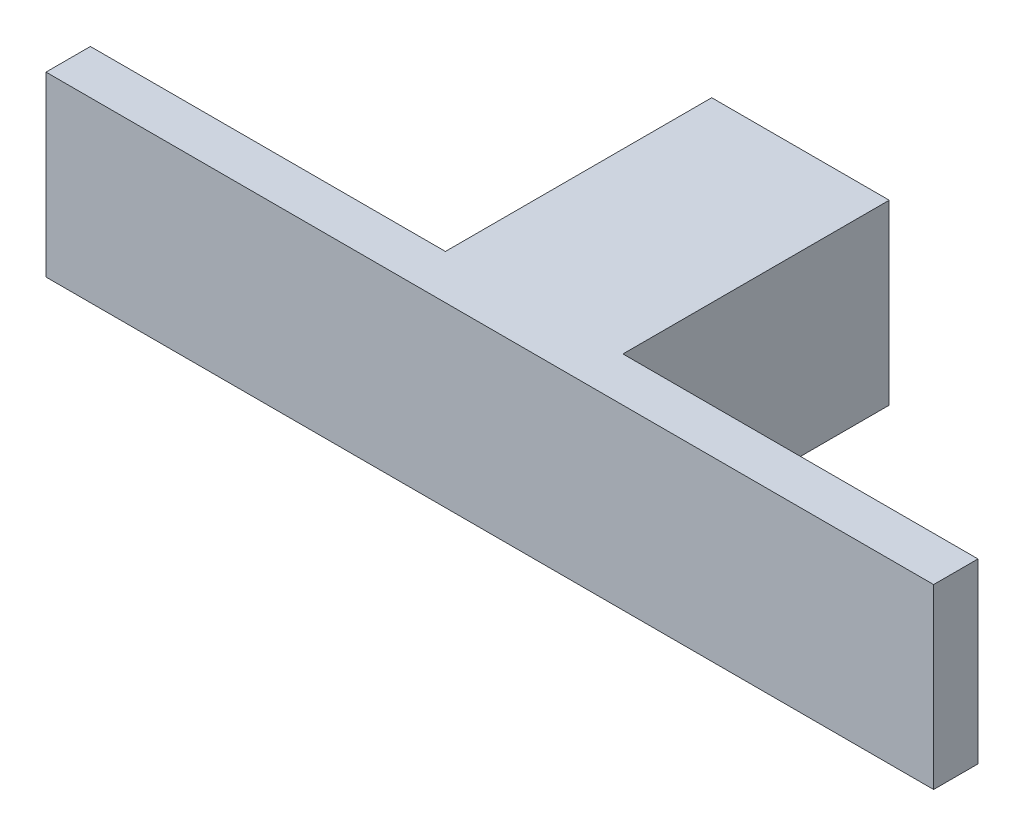
ISO-10303-21;
HEADER;
FILE_DESCRIPTION(('STEP AP214'),'2;1');
FILE_NAME('part.step','',(''),(''),'','','');
FILE_SCHEMA(('AUTOMOTIVE_DESIGN { 1 0 10303 214 1 1 1 1 }'));
ENDSEC;
DATA;
#1=APPLICATION_CONTEXT('core data for automotive mechanical design processes');
#2=APPLICATION_PROTOCOL_DEFINITION('international standard','automotive_design',2000,#1);
#3=PRODUCT_CONTEXT('',#1,'mechanical');
#4=PRODUCT('Part','Part','',(#3));
#5=PRODUCT_RELATED_PRODUCT_CATEGORY('part','',(#4));
#6=PRODUCT_DEFINITION_FORMATION('','',#4);
#7=PRODUCT_DEFINITION_CONTEXT('part definition',#1,'design');
#8=PRODUCT_DEFINITION('design','',#6,#7);
#9=PRODUCT_DEFINITION_SHAPE('','',#8);
#10=(LENGTH_UNIT() NAMED_UNIT(*) SI_UNIT(.MILLI.,.METRE.));
#11=(NAMED_UNIT(*) PLANE_ANGLE_UNIT() SI_UNIT($,.RADIAN.));
#12=(NAMED_UNIT(*) SI_UNIT($,.STERADIAN.) SOLID_ANGLE_UNIT());
#13=UNCERTAINTY_MEASURE_WITH_UNIT(LENGTH_MEASURE(1.E-05),#10,'distance_accuracy_value','');
#14=(GEOMETRIC_REPRESENTATION_CONTEXT(3) GLOBAL_UNCERTAINTY_ASSIGNED_CONTEXT((#13)) GLOBAL_UNIT_ASSIGNED_CONTEXT((#10,
#11,#12)) REPRESENTATION_CONTEXT('',''));
#15=CARTESIAN_POINT('',(0.,0.,0.));
#16=DIRECTION('',(0.,0.,1.));
#17=DIRECTION('',(1.,0.,0.));
#18=AXIS2_PLACEMENT_3D('',#15,#16,#17);
#19=CARTESIAN_POINT('',(50.,20.,35.));
#20=DIRECTION('',(-1.,0.,0.));
#21=DIRECTION('',(0.,0.,1.));
#22=AXIS2_PLACEMENT_3D('',#19,#20,#21);
#23=PLANE('',#22);
#24=DIRECTION('',(0.,0.,-1.));
#25=VECTOR('',#24,1.);
#26=CARTESIAN_POINT('',(50.,0.,35.));
#27=LINE('',#26,#25);
#28=CARTESIAN_POINT('',(50.,0.,35.));
#29=VERTEX_POINT('',#28);
#30=CARTESIAN_POINT('',(50.,0.,30.));
#31=VERTEX_POINT('',#30);
#32=EDGE_CURVE('E140',#29,#31,#27,.T.);
#33=ORIENTED_EDGE('',*,*,#32,.T.);
#34=DIRECTION('',(0.,-1.,0.));
#35=VECTOR('',#34,1.);
#36=CARTESIAN_POINT('',(50.,20.,30.));
#37=LINE('',#36,#35);
#38=CARTESIAN_POINT('',(50.,20.,30.));
#39=VERTEX_POINT('',#38);
#40=EDGE_CURVE('E11',#39,#31,#37,.T.);
#41=ORIENTED_EDGE('',*,*,#40,.F.);
#42=DIRECTION('',(0.,0.,-1.));
#43=VECTOR('',#42,1.);
#44=CARTESIAN_POINT('',(50.,20.,35.));
#45=LINE('',#44,#43);
#46=CARTESIAN_POINT('',(50.,20.,35.));
#47=VERTEX_POINT('',#46);
#48=EDGE_CURVE('E162',#47,#39,#45,.T.);
#49=ORIENTED_EDGE('',*,*,#48,.F.);
#50=DIRECTION('',(0.,-1.,0.));
#51=VECTOR('',#50,1.);
#52=CARTESIAN_POINT('',(50.,20.,35.));
#53=LINE('',#52,#51);
#54=EDGE_CURVE('E136',#47,#29,#53,.T.);
#55=ORIENTED_EDGE('',*,*,#54,.T.);
#56=EDGE_LOOP('',(#33,#41,#49,#55));
#57=FACE_BOUND('',#56,.T.);
#58=ADVANCED_FACE('F39',(#57),#23,.F.);
#59=CARTESIAN_POINT('',(50.,20.,30.));
#60=DIRECTION('',(0.,0.,1.));
#61=DIRECTION('',(1.,0.,0.));
#62=AXIS2_PLACEMENT_3D('',#59,#60,#61);
#63=PLANE('',#62);
#64=DIRECTION('',(-1.,0.,0.));
#65=VECTOR('',#64,1.);
#66=CARTESIAN_POINT('',(50.,0.,30.));
#67=LINE('',#66,#65);
#68=CARTESIAN_POINT('',(10.,0.,30.));
#69=VERTEX_POINT('',#68);
#70=EDGE_CURVE('E144',#31,#69,#67,.T.);
#71=ORIENTED_EDGE('',*,*,#70,.T.);
#72=DIRECTION('',(0.,-1.,0.));
#73=VECTOR('',#72,1.);
#74=CARTESIAN_POINT('',(10.,20.,30.));
#75=LINE('',#74,#73);
#76=CARTESIAN_POINT('',(10.,20.,30.));
#77=VERTEX_POINT('',#76);
#78=EDGE_CURVE('E48',#77,#69,#75,.T.);
#79=ORIENTED_EDGE('',*,*,#78,.F.);
#80=DIRECTION('',(-1.,0.,0.));
#81=VECTOR('',#80,1.);
#82=CARTESIAN_POINT('',(50.,20.,30.));
#83=LINE('',#82,#81);
#84=EDGE_CURVE('E99',#39,#77,#83,.T.);
#85=ORIENTED_EDGE('',*,*,#84,.F.);
#86=ORIENTED_EDGE('',*,*,#40,.T.);
#87=EDGE_LOOP('',(#71,#79,#85,#86));
#88=FACE_BOUND('',#87,.T.);
#89=ADVANCED_FACE('F208',(#88),#63,.F.);
#90=CARTESIAN_POINT('',(10.,20.,30.));
#91=DIRECTION('',(-1.,0.,0.));
#92=DIRECTION('',(0.,0.,1.));
#93=AXIS2_PLACEMENT_3D('',#90,#91,#92);
#94=PLANE('',#93);
#95=DIRECTION('',(0.,0.,-1.));
#96=VECTOR('',#95,1.);
#97=CARTESIAN_POINT('',(10.,0.,30.));
#98=LINE('',#97,#96);
#99=CARTESIAN_POINT('',(10.,0.,0.));
#100=VERTEX_POINT('',#99);
#101=EDGE_CURVE('E147',#69,#100,#98,.T.);
#102=ORIENTED_EDGE('',*,*,#101,.T.);
#103=DIRECTION('',(0.,-1.,0.));
#104=VECTOR('',#103,1.);
#105=CARTESIAN_POINT('',(10.,20.,0.));
#106=LINE('',#105,#104);
#107=CARTESIAN_POINT('',(10.,20.,0.));
#108=VERTEX_POINT('',#107);
#109=EDGE_CURVE('E173',#108,#100,#106,.T.);
#110=ORIENTED_EDGE('',*,*,#109,.F.);
#111=DIRECTION('',(0.,0.,-1.));
#112=VECTOR('',#111,1.);
#113=CARTESIAN_POINT('',(10.,20.,30.));
#114=LINE('',#113,#112);
#115=EDGE_CURVE('E183',#77,#108,#114,.T.);
#116=ORIENTED_EDGE('',*,*,#115,.F.);
#117=ORIENTED_EDGE('',*,*,#78,.T.);
#118=EDGE_LOOP('',(#102,#110,#116,#117));
#119=FACE_BOUND('',#118,.T.);
#120=ADVANCED_FACE('F181',(#119),#94,.F.);
#121=CARTESIAN_POINT('',(-10.,20.,0.));
#122=DIRECTION('',(0.,0.,1.));
#123=DIRECTION('',(1.,0.,0.));
#124=AXIS2_PLACEMENT_3D('',#121,#122,#123);
#125=PLANE('',#124);
#126=DIRECTION('',(-1.,0.,0.));
#127=VECTOR('',#126,1.);
#128=CARTESIAN_POINT('',(-10.,0.,0.));
#129=LINE('',#128,#127);
#130=CARTESIAN_POINT('',(-10.,0.,0.));
#131=VERTEX_POINT('',#130);
#132=EDGE_CURVE('E150',#100,#131,#129,.T.);
#133=ORIENTED_EDGE('',*,*,#132,.T.);
#134=DIRECTION('',(0.,-1.,0.));
#135=VECTOR('',#134,1.);
#136=CARTESIAN_POINT('',(-10.,20.,0.));
#137=LINE('',#136,#135);
#138=CARTESIAN_POINT('',(-10.,20.,0.));
#139=VERTEX_POINT('',#138);
#140=EDGE_CURVE('E169',#139,#131,#137,.T.);
#141=ORIENTED_EDGE('',*,*,#140,.F.);
#142=DIRECTION('',(-1.,0.,0.));
#143=VECTOR('',#142,1.);
#144=CARTESIAN_POINT('',(-10.,20.,0.));
#145=LINE('',#144,#143);
#146=EDGE_CURVE('E196',#108,#139,#145,.T.);
#147=ORIENTED_EDGE('',*,*,#146,.F.);
#148=ORIENTED_EDGE('',*,*,#109,.T.);
#149=EDGE_LOOP('',(#133,#141,#147,#148));
#150=FACE_BOUND('',#149,.T.);
#151=ADVANCED_FACE('F191',(#150),#125,.F.);
#152=CARTESIAN_POINT('',(-10.,20.,30.));
#153=DIRECTION('',(1.,0.,0.));
#154=DIRECTION('',(0.,0.,-1.));
#155=AXIS2_PLACEMENT_3D('',#152,#153,#154);
#156=PLANE('',#155);
#157=DIRECTION('',(0.,0.,1.));
#158=VECTOR('',#157,1.);
#159=CARTESIAN_POINT('',(-10.,0.,30.));
#160=LINE('',#159,#158);
#161=CARTESIAN_POINT('',(-10.,0.,30.));
#162=VERTEX_POINT('',#161);
#163=EDGE_CURVE('E153',#131,#162,#160,.T.);
#164=ORIENTED_EDGE('',*,*,#163,.T.);
#165=DIRECTION('',(0.,-1.,0.));
#166=VECTOR('',#165,1.);
#167=CARTESIAN_POINT('',(-10.,20.,30.));
#168=LINE('',#167,#166);
#169=CARTESIAN_POINT('',(-10.,20.,30.));
#170=VERTEX_POINT('',#169);
#171=EDGE_CURVE('E129',#170,#162,#168,.T.);
#172=ORIENTED_EDGE('',*,*,#171,.F.);
#173=DIRECTION('',(0.,0.,1.));
#174=VECTOR('',#173,1.);
#175=CARTESIAN_POINT('',(-10.,20.,30.));
#176=LINE('',#175,#174);
#177=EDGE_CURVE('E118',#139,#170,#176,.T.);
#178=ORIENTED_EDGE('',*,*,#177,.F.);
#179=ORIENTED_EDGE('',*,*,#140,.T.);
#180=EDGE_LOOP('',(#164,#172,#178,#179));
#181=FACE_BOUND('',#180,.T.);
#182=ADVANCED_FACE('F194',(#181),#156,.F.);
#183=CARTESIAN_POINT('',(-50.,20.,30.));
#184=DIRECTION('',(0.,0.,1.));
#185=DIRECTION('',(1.,0.,0.));
#186=AXIS2_PLACEMENT_3D('',#183,#184,#185);
#187=PLANE('',#186);
#188=DIRECTION('',(-1.,0.,0.));
#189=VECTOR('',#188,1.);
#190=CARTESIAN_POINT('',(-50.,0.,30.));
#191=LINE('',#190,#189);
#192=CARTESIAN_POINT('',(-50.,0.,30.));
#193=VERTEX_POINT('',#192);
#194=EDGE_CURVE('E127',#162,#193,#191,.T.);
#195=ORIENTED_EDGE('',*,*,#194,.T.);
#196=DIRECTION('',(0.,-1.,0.));
#197=VECTOR('',#196,1.);
#198=CARTESIAN_POINT('',(-50.,20.,30.));
#199=LINE('',#198,#197);
#200=CARTESIAN_POINT('',(-50.,20.,30.));
#201=VERTEX_POINT('',#200);
#202=EDGE_CURVE('E124',#201,#193,#199,.T.);
#203=ORIENTED_EDGE('',*,*,#202,.F.);
#204=DIRECTION('',(-1.,0.,0.));
#205=VECTOR('',#204,1.);
#206=CARTESIAN_POINT('',(-50.,20.,30.));
#207=LINE('',#206,#205);
#208=EDGE_CURVE('E112',#170,#201,#207,.T.);
#209=ORIENTED_EDGE('',*,*,#208,.F.);
#210=ORIENTED_EDGE('',*,*,#171,.T.);
#211=EDGE_LOOP('',(#195,#203,#209,#210));
#212=FACE_BOUND('',#211,.T.);
#213=ADVANCED_FACE('F125',(#212),#187,.F.);
#214=CARTESIAN_POINT('',(-50.,20.,35.));
#215=DIRECTION('',(1.,0.,0.));
#216=DIRECTION('',(0.,0.,-1.));
#217=AXIS2_PLACEMENT_3D('',#214,#215,#216);
#218=PLANE('',#217);
#219=DIRECTION('',(0.,0.,1.));
#220=VECTOR('',#219,1.);
#221=CARTESIAN_POINT('',(-50.,0.,35.));
#222=LINE('',#221,#220);
#223=CARTESIAN_POINT('',(-50.,0.,35.));
#224=VERTEX_POINT('',#223);
#225=EDGE_CURVE('E85',#193,#224,#222,.T.);
#226=ORIENTED_EDGE('',*,*,#225,.T.);
#227=DIRECTION('',(0.,-1.,0.));
#228=VECTOR('',#227,1.);
#229=CARTESIAN_POINT('',(-50.,20.,35.));
#230=LINE('',#229,#228);
#231=CARTESIAN_POINT('',(-50.,20.,35.));
#232=VERTEX_POINT('',#231);
#233=EDGE_CURVE('E130',#232,#224,#230,.T.);
#234=ORIENTED_EDGE('',*,*,#233,.F.);
#235=DIRECTION('',(0.,0.,1.));
#236=VECTOR('',#235,1.);
#237=CARTESIAN_POINT('',(-50.,20.,35.));
#238=LINE('',#237,#236);
#239=EDGE_CURVE('E116',#201,#232,#238,.T.);
#240=ORIENTED_EDGE('',*,*,#239,.F.);
#241=ORIENTED_EDGE('',*,*,#202,.T.);
#242=EDGE_LOOP('',(#226,#234,#240,#241));
#243=FACE_BOUND('',#242,.T.);
#244=ADVANCED_FACE('F132',(#243),#218,.F.);
#245=CARTESIAN_POINT('',(50.,20.,35.));
#246=DIRECTION('',(0.,0.,-1.));
#247=DIRECTION('',(-1.,0.,0.));
#248=AXIS2_PLACEMENT_3D('',#245,#246,#247);
#249=PLANE('',#248);
#250=DIRECTION('',(1.,0.,0.));
#251=VECTOR('',#250,1.);
#252=CARTESIAN_POINT('',(50.,0.,35.));
#253=LINE('',#252,#251);
#254=EDGE_CURVE('E91',#224,#29,#253,.T.);
#255=ORIENTED_EDGE('',*,*,#254,.T.);
#256=ORIENTED_EDGE('',*,*,#54,.F.);
#257=DIRECTION('',(1.,0.,0.));
#258=VECTOR('',#257,1.);
#259=CARTESIAN_POINT('',(50.,20.,35.));
#260=LINE('',#259,#258);
#261=EDGE_CURVE('E56',#232,#47,#260,.T.);
#262=ORIENTED_EDGE('',*,*,#261,.F.);
#263=ORIENTED_EDGE('',*,*,#233,.T.);
#264=EDGE_LOOP('',(#255,#256,#262,#263));
#265=FACE_BOUND('',#264,.T.);
#266=ADVANCED_FACE('F224',(#265),#249,.F.);
#267=CARTESIAN_POINT('',(0.,20.,0.));
#268=DIRECTION('',(0.,1.,0.));
#269=DIRECTION('',(0.,0.,1.));
#270=AXIS2_PLACEMENT_3D('',#267,#268,#269);
#271=PLANE('',#270);
#272=ORIENTED_EDGE('',*,*,#48,.T.);
#273=ORIENTED_EDGE('',*,*,#84,.T.);
#274=ORIENTED_EDGE('',*,*,#115,.T.);
#275=ORIENTED_EDGE('',*,*,#146,.T.);
#276=ORIENTED_EDGE('',*,*,#177,.T.);
#277=ORIENTED_EDGE('',*,*,#208,.T.);
#278=ORIENTED_EDGE('',*,*,#239,.T.);
#279=ORIENTED_EDGE('',*,*,#261,.T.);
#280=EDGE_LOOP('',(#272,#273,#274,#275,#276,#277,#278,#279));
#281=FACE_BOUND('',#280,.T.);
#282=ADVANCED_FACE('F114',(#281),#271,.T.);
#283=CARTESIAN_POINT('',(0.,0.,0.));
#284=DIRECTION('',(0.,1.,0.));
#285=DIRECTION('',(0.,0.,1.));
#286=AXIS2_PLACEMENT_3D('',#283,#284,#285);
#287=PLANE('',#286);
#288=ORIENTED_EDGE('',*,*,#32,.F.);
#289=ORIENTED_EDGE('',*,*,#254,.F.);
#290=ORIENTED_EDGE('',*,*,#225,.F.);
#291=ORIENTED_EDGE('',*,*,#194,.F.);
#292=ORIENTED_EDGE('',*,*,#163,.F.);
#293=ORIENTED_EDGE('',*,*,#132,.F.);
#294=ORIENTED_EDGE('',*,*,#101,.F.);
#295=ORIENTED_EDGE('',*,*,#70,.F.);
#296=EDGE_LOOP('',(#288,#289,#290,#291,#292,#293,#294,#295));
#297=FACE_BOUND('',#296,.T.);
#298=ADVANCED_FACE('F187',(#297),#287,.F.);
#299=CLOSED_SHELL('',(#58,#89,#120,#151,#182,#213,#244,#266,#282,#298));
#300=MANIFOLD_SOLID_BREP('B2',#299);
#301=ADVANCED_BREP_SHAPE_REPRESENTATION('',(#18,#300),#14);
#302=SHAPE_DEFINITION_REPRESENTATION(#9,#301);
ENDSEC;
END-ISO-10303-21;
